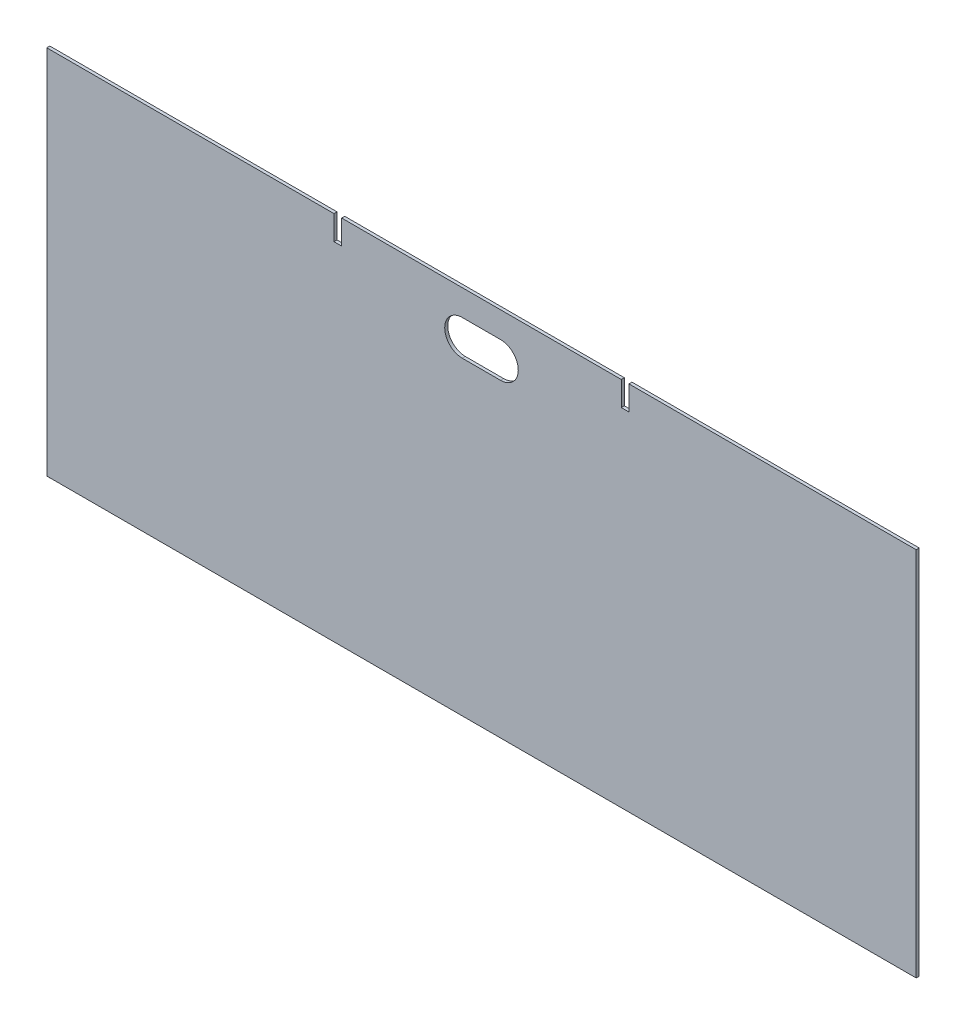
ISO-10303-21;
HEADER;
FILE_DESCRIPTION(('STEP AP214'),'2;1');
FILE_NAME('part.step','',(''),(''),'','','');
FILE_SCHEMA(('AUTOMOTIVE_DESIGN { 1 0 10303 214 1 1 1 1 }'));
ENDSEC;
DATA;
#1=APPLICATION_CONTEXT('core data for automotive mechanical design processes');
#2=APPLICATION_PROTOCOL_DEFINITION('international standard','automotive_design',2000,#1);
#3=PRODUCT_CONTEXT('',#1,'mechanical');
#4=PRODUCT('Part','Part','',(#3));
#5=PRODUCT_RELATED_PRODUCT_CATEGORY('part','',(#4));
#6=PRODUCT_DEFINITION_FORMATION('','',#4);
#7=PRODUCT_DEFINITION_CONTEXT('part definition',#1,'design');
#8=PRODUCT_DEFINITION('design','',#6,#7);
#9=PRODUCT_DEFINITION_SHAPE('','',#8);
#10=(LENGTH_UNIT() NAMED_UNIT(*) SI_UNIT(.MILLI.,.METRE.));
#11=(NAMED_UNIT(*) PLANE_ANGLE_UNIT() SI_UNIT($,.RADIAN.));
#12=(NAMED_UNIT(*) SI_UNIT($,.STERADIAN.) SOLID_ANGLE_UNIT());
#13=UNCERTAINTY_MEASURE_WITH_UNIT(LENGTH_MEASURE(1.E-05),#10,'distance_accuracy_value','');
#14=(GEOMETRIC_REPRESENTATION_CONTEXT(3) GLOBAL_UNCERTAINTY_ASSIGNED_CONTEXT((#13)) GLOBAL_UNIT_ASSIGNED_CONTEXT((#10,
#11,#12)) REPRESENTATION_CONTEXT('',''));
#15=CARTESIAN_POINT('',(0.,0.,0.));
#16=DIRECTION('',(0.,0.,1.));
#17=DIRECTION('',(1.,0.,0.));
#18=AXIS2_PLACEMENT_3D('',#15,#16,#17);
#19=CARTESIAN_POINT('',(-908.05,774.7,6.35));
#20=DIRECTION('',(0.,-1.,0.));
#21=DIRECTION('',(0.,0.,-1.));
#22=AXIS2_PLACEMENT_3D('',#19,#20,#21);
#23=PLANE('',#22);
#24=DIRECTION('',(-1.,0.,0.));
#25=VECTOR('',#24,1.);
#26=CARTESIAN_POINT('',(-908.05,774.7,6.35));
#27=LINE('',#26,#25);
#28=CARTESIAN_POINT('',(-307.975,774.7,6.35));
#29=VERTEX_POINT('',#28);
#30=CARTESIAN_POINT('',(-908.05,774.7,6.35));
#31=VERTEX_POINT('',#30);
#32=EDGE_CURVE('E178',#29,#31,#27,.T.);
#33=ORIENTED_EDGE('',*,*,#32,.F.);
#34=DIRECTION('',(0.,0.,1.));
#35=VECTOR('',#34,1.);
#36=CARTESIAN_POINT('',(-307.975,774.7,0.));
#37=LINE('',#36,#35);
#38=CARTESIAN_POINT('',(-307.975,774.7,0.));
#39=VERTEX_POINT('',#38);
#40=EDGE_CURVE('E188',#39,#29,#37,.T.);
#41=ORIENTED_EDGE('',*,*,#40,.F.);
#42=DIRECTION('',(-1.,0.,0.));
#43=VECTOR('',#42,1.);
#44=CARTESIAN_POINT('',(-908.05,774.7,0.));
#45=LINE('',#44,#43);
#46=CARTESIAN_POINT('',(-908.05,774.7,0.));
#47=VERTEX_POINT('',#46);
#48=EDGE_CURVE('E192',#39,#47,#45,.T.);
#49=ORIENTED_EDGE('',*,*,#48,.T.);
#50=DIRECTION('',(0.,0.,-1.));
#51=VECTOR('',#50,1.);
#52=CARTESIAN_POINT('',(-908.05,774.7,6.35));
#53=LINE('',#52,#51);
#54=EDGE_CURVE('E182',#31,#47,#53,.T.);
#55=ORIENTED_EDGE('',*,*,#54,.F.);
#56=EDGE_LOOP('',(#33,#41,#49,#55));
#57=FACE_BOUND('',#56,.T.);
#58=ADVANCED_FACE('F45',(#57),#23,.F.);
#59=CARTESIAN_POINT('',(292.1,774.7,0.));
#60=VERTEX_POINT('',#59);
#61=CARTESIAN_POINT('',(-292.1,774.7,0.));
#62=VERTEX_POINT('',#61);
#63=EDGE_CURVE('E194',#60,#62,#45,.T.);
#64=ORIENTED_EDGE('',*,*,#63,.T.);
#65=DIRECTION('',(0.,0.,1.));
#66=VECTOR('',#65,1.);
#67=CARTESIAN_POINT('',(-292.1,774.7,0.));
#68=LINE('',#67,#66);
#69=CARTESIAN_POINT('',(-292.1,774.7,6.35));
#70=VERTEX_POINT('',#69);
#71=EDGE_CURVE('E238',#62,#70,#68,.T.);
#72=ORIENTED_EDGE('',*,*,#71,.T.);
#73=CARTESIAN_POINT('',(292.1,774.7,6.35));
#74=VERTEX_POINT('',#73);
#75=EDGE_CURVE('E183',#74,#70,#27,.T.);
#76=ORIENTED_EDGE('',*,*,#75,.F.);
#77=DIRECTION('',(0.,0.,1.));
#78=VECTOR('',#77,1.);
#79=CARTESIAN_POINT('',(292.1,774.7,0.));
#80=LINE('',#79,#78);
#81=EDGE_CURVE('E206',#60,#74,#80,.T.);
#82=ORIENTED_EDGE('',*,*,#81,.F.);
#83=EDGE_LOOP('',(#64,#72,#76,#82));
#84=FACE_BOUND('',#83,.T.);
#85=ADVANCED_FACE('F262',(#84),#23,.F.);
#86=CARTESIAN_POINT('',(-908.05,0.,6.35));
#87=DIRECTION('',(1.,0.,0.));
#88=DIRECTION('',(0.,0.,-1.));
#89=AXIS2_PLACEMENT_3D('',#86,#87,#88);
#90=PLANE('',#89);
#91=DIRECTION('',(0.,-1.,0.));
#92=VECTOR('',#91,1.);
#93=CARTESIAN_POINT('',(-908.05,0.,0.));
#94=LINE('',#93,#92);
#95=CARTESIAN_POINT('',(-908.05,0.,0.));
#96=VERTEX_POINT('',#95);
#97=EDGE_CURVE('E184',#47,#96,#94,.T.);
#98=ORIENTED_EDGE('',*,*,#97,.T.);
#99=DIRECTION('',(0.,0.,-1.));
#100=VECTOR('',#99,1.);
#101=CARTESIAN_POINT('',(-908.05,0.,6.35));
#102=LINE('',#101,#100);
#103=CARTESIAN_POINT('',(-908.05,0.,6.35));
#104=VERTEX_POINT('',#103);
#105=EDGE_CURVE('E11',#104,#96,#102,.T.);
#106=ORIENTED_EDGE('',*,*,#105,.F.);
#107=DIRECTION('',(0.,-1.,0.));
#108=VECTOR('',#107,1.);
#109=CARTESIAN_POINT('',(-908.05,0.,6.35));
#110=LINE('',#109,#108);
#111=EDGE_CURVE('E170',#31,#104,#110,.T.);
#112=ORIENTED_EDGE('',*,*,#111,.F.);
#113=ORIENTED_EDGE('',*,*,#54,.T.);
#114=EDGE_LOOP('',(#98,#106,#112,#113));
#115=FACE_BOUND('',#114,.T.);
#116=ADVANCED_FACE('F47',(#115),#90,.F.);
#117=CARTESIAN_POINT('',(-908.05,0.,6.35));
#118=DIRECTION('',(0.,1.,0.));
#119=DIRECTION('',(0.,0.,1.));
#120=AXIS2_PLACEMENT_3D('',#117,#118,#119);
#121=PLANE('',#120);
#122=DIRECTION('',(1.,0.,0.));
#123=VECTOR('',#122,1.);
#124=CARTESIAN_POINT('',(-908.05,0.,0.));
#125=LINE('',#124,#123);
#126=CARTESIAN_POINT('',(908.05,0.,0.));
#127=VERTEX_POINT('',#126);
#128=EDGE_CURVE('E187',#96,#127,#125,.T.);
#129=ORIENTED_EDGE('',*,*,#128,.T.);
#130=DIRECTION('',(0.,0.,-1.));
#131=VECTOR('',#130,1.);
#132=CARTESIAN_POINT('',(908.05,0.,6.35));
#133=LINE('',#132,#131);
#134=CARTESIAN_POINT('',(908.05,0.,6.35));
#135=VERTEX_POINT('',#134);
#136=EDGE_CURVE('E54',#135,#127,#133,.T.);
#137=ORIENTED_EDGE('',*,*,#136,.F.);
#138=DIRECTION('',(1.,0.,0.));
#139=VECTOR('',#138,1.);
#140=CARTESIAN_POINT('',(-908.05,0.,6.35));
#141=LINE('',#140,#139);
#142=EDGE_CURVE('E173',#104,#135,#141,.T.);
#143=ORIENTED_EDGE('',*,*,#142,.F.);
#144=ORIENTED_EDGE('',*,*,#105,.T.);
#145=EDGE_LOOP('',(#129,#137,#143,#144));
#146=FACE_BOUND('',#145,.T.);
#147=ADVANCED_FACE('F282',(#146),#121,.F.);
#148=CARTESIAN_POINT('',(908.05,0.,6.35));
#149=DIRECTION('',(-1.,0.,0.));
#150=DIRECTION('',(0.,0.,1.));
#151=AXIS2_PLACEMENT_3D('',#148,#149,#150);
#152=PLANE('',#151);
#153=DIRECTION('',(0.,1.,0.));
#154=VECTOR('',#153,1.);
#155=CARTESIAN_POINT('',(908.05,0.,0.));
#156=LINE('',#155,#154);
#157=CARTESIAN_POINT('',(908.05,774.7,0.));
#158=VERTEX_POINT('',#157);
#159=EDGE_CURVE('E190',#127,#158,#156,.T.);
#160=ORIENTED_EDGE('',*,*,#159,.T.);
#161=DIRECTION('',(0.,0.,-1.));
#162=VECTOR('',#161,1.);
#163=CARTESIAN_POINT('',(908.05,774.7,6.35));
#164=LINE('',#163,#162);
#165=CARTESIAN_POINT('',(908.05,774.7,6.35));
#166=VERTEX_POINT('',#165);
#167=EDGE_CURVE('E197',#166,#158,#164,.T.);
#168=ORIENTED_EDGE('',*,*,#167,.F.);
#169=DIRECTION('',(0.,1.,0.));
#170=VECTOR('',#169,1.);
#171=CARTESIAN_POINT('',(908.05,0.,6.35));
#172=LINE('',#171,#170);
#173=EDGE_CURVE('E176',#135,#166,#172,.T.);
#174=ORIENTED_EDGE('',*,*,#173,.F.);
#175=ORIENTED_EDGE('',*,*,#136,.T.);
#176=EDGE_LOOP('',(#160,#168,#174,#175));
#177=FACE_BOUND('',#176,.T.);
#178=ADVANCED_FACE('F273',(#177),#152,.F.);
#179=CARTESIAN_POINT('',(307.975,774.7,0.));
#180=VERTEX_POINT('',#179);
#181=EDGE_CURVE('E174',#158,#180,#45,.T.);
#182=ORIENTED_EDGE('',*,*,#181,.T.);
#183=DIRECTION('',(0.,0.,1.));
#184=VECTOR('',#183,1.);
#185=CARTESIAN_POINT('',(307.975,774.7,0.));
#186=LINE('',#185,#184);
#187=CARTESIAN_POINT('',(307.975,774.7,6.35));
#188=VERTEX_POINT('',#187);
#189=EDGE_CURVE('E146',#180,#188,#186,.T.);
#190=ORIENTED_EDGE('',*,*,#189,.T.);
#191=EDGE_CURVE('E179',#166,#188,#27,.T.);
#192=ORIENTED_EDGE('',*,*,#191,.F.);
#193=ORIENTED_EDGE('',*,*,#167,.T.);
#194=EDGE_LOOP('',(#182,#190,#192,#193));
#195=FACE_BOUND('',#194,.T.);
#196=ADVANCED_FACE('F265',(#195),#23,.F.);
#197=CARTESIAN_POINT('',(0.,0.,6.35));
#198=DIRECTION('',(0.,0.,-1.));
#199=DIRECTION('',(-1.,0.,0.));
#200=AXIS2_PLACEMENT_3D('',#197,#198,#199);
#201=PLANE('',#200);
#202=DIRECTION('',(1.,0.,0.));
#203=VECTOR('',#202,1.);
#204=CARTESIAN_POINT('',(-40.,647.075,6.35));
#205=LINE('',#204,#203);
#206=CARTESIAN_POINT('',(-40.,647.075,6.35));
#207=VERTEX_POINT('',#206);
#208=CARTESIAN_POINT('',(40.,647.075,6.35));
#209=VERTEX_POINT('',#208);
#210=EDGE_CURVE('E202',#207,#209,#205,.T.);
#211=ORIENTED_EDGE('',*,*,#210,.F.);
#212=CARTESIAN_POINT('',(-40.,683.9,6.35));
#213=DIRECTION('',(0.,0.,1.));
#214=DIRECTION('',(1.,0.,0.));
#215=AXIS2_PLACEMENT_3D('',#212,#213,#214);
#216=CIRCLE('',#215,36.8249999999999);
#217=CARTESIAN_POINT('',(-40.,720.725,6.35));
#218=VERTEX_POINT('',#217);
#219=EDGE_CURVE('E49',#218,#207,#216,.T.);
#220=ORIENTED_EDGE('',*,*,#219,.F.);
#221=DIRECTION('',(-1.,0.,0.));
#222=VECTOR('',#221,1.);
#223=CARTESIAN_POINT('',(-40.,720.725,6.35));
#224=LINE('',#223,#222);
#225=CARTESIAN_POINT('',(40.,720.725,6.35));
#226=VERTEX_POINT('',#225);
#227=EDGE_CURVE('E90',#226,#218,#224,.T.);
#228=ORIENTED_EDGE('',*,*,#227,.F.);
#229=CARTESIAN_POINT('',(40.,683.9,6.35));
#230=DIRECTION('',(0.,0.,1.));
#231=DIRECTION('',(1.,0.,0.));
#232=AXIS2_PLACEMENT_3D('',#229,#230,#231);
#233=CIRCLE('',#232,36.825);
#234=EDGE_CURVE('E204',#209,#226,#233,.T.);
#235=ORIENTED_EDGE('',*,*,#234,.F.);
#236=EDGE_LOOP('',(#211,#220,#228,#235));
#237=FACE_BOUND('',#236,.T.);
#238=DIRECTION('',(1.,0.,0.));
#239=VECTOR('',#238,1.);
#240=CARTESIAN_POINT('',(-307.975,723.9,6.35));
#241=LINE('',#240,#239);
#242=CARTESIAN_POINT('',(-307.975,723.9,6.35));
#243=VERTEX_POINT('',#242);
#244=CARTESIAN_POINT('',(-292.1,723.9,6.35));
#245=VERTEX_POINT('',#244);
#246=EDGE_CURVE('E219',#243,#245,#241,.T.);
#247=ORIENTED_EDGE('',*,*,#246,.F.);
#248=DIRECTION('',(0.,-1.,0.));
#249=VECTOR('',#248,1.);
#250=CARTESIAN_POINT('',(-307.975,774.7,6.35));
#251=LINE('',#250,#249);
#252=EDGE_CURVE('E217',#29,#243,#251,.T.);
#253=ORIENTED_EDGE('',*,*,#252,.F.);
#254=ORIENTED_EDGE('',*,*,#32,.T.);
#255=ORIENTED_EDGE('',*,*,#111,.T.);
#256=ORIENTED_EDGE('',*,*,#142,.T.);
#257=ORIENTED_EDGE('',*,*,#173,.T.);
#258=ORIENTED_EDGE('',*,*,#191,.T.);
#259=DIRECTION('',(0.,1.,0.));
#260=VECTOR('',#259,1.);
#261=CARTESIAN_POINT('',(307.975,774.7,6.35));
#262=LINE('',#261,#260);
#263=CARTESIAN_POINT('',(307.975,723.9,6.35));
#264=VERTEX_POINT('',#263);
#265=EDGE_CURVE('E166',#264,#188,#262,.T.);
#266=ORIENTED_EDGE('',*,*,#265,.F.);
#267=DIRECTION('',(1.,0.,0.));
#268=VECTOR('',#267,1.);
#269=CARTESIAN_POINT('',(292.1,723.9,6.35));
#270=LINE('',#269,#268);
#271=CARTESIAN_POINT('',(292.1,723.9,6.35));
#272=VERTEX_POINT('',#271);
#273=EDGE_CURVE('E159',#272,#264,#270,.T.);
#274=ORIENTED_EDGE('',*,*,#273,.F.);
#275=DIRECTION('',(0.,-1.,0.));
#276=VECTOR('',#275,1.);
#277=CARTESIAN_POINT('',(292.1,774.7,6.35));
#278=LINE('',#277,#276);
#279=EDGE_CURVE('E216',#74,#272,#278,.T.);
#280=ORIENTED_EDGE('',*,*,#279,.F.);
#281=ORIENTED_EDGE('',*,*,#75,.T.);
#282=DIRECTION('',(0.,1.,0.));
#283=VECTOR('',#282,1.);
#284=CARTESIAN_POINT('',(-292.1,774.7,6.35));
#285=LINE('',#284,#283);
#286=EDGE_CURVE('E228',#245,#70,#285,.T.);
#287=ORIENTED_EDGE('',*,*,#286,.F.);
#288=EDGE_LOOP('',(#247,#253,#254,#255,#256,#257,#258,#266,#274,#280,#281,#287));
#289=FACE_BOUND('',#288,.T.);
#290=ADVANCED_FACE('F256',(#237,#289),#201,.F.);
#291=CARTESIAN_POINT('',(0.,0.,0.));
#292=DIRECTION('',(0.,0.,-1.));
#293=DIRECTION('',(-1.,0.,0.));
#294=AXIS2_PLACEMENT_3D('',#291,#292,#293);
#295=PLANE('',#294);
#296=CARTESIAN_POINT('',(-40.,683.9,0.));
#297=DIRECTION('',(0.,0.,1.));
#298=DIRECTION('',(1.,0.,0.));
#299=AXIS2_PLACEMENT_3D('',#296,#297,#298);
#300=CIRCLE('',#299,36.8249999999999);
#301=CARTESIAN_POINT('',(-40.,720.725,0.));
#302=VERTEX_POINT('',#301);
#303=CARTESIAN_POINT('',(-40.,647.075,0.));
#304=VERTEX_POINT('',#303);
#305=EDGE_CURVE('E329',#302,#304,#300,.T.);
#306=ORIENTED_EDGE('',*,*,#305,.T.);
#307=DIRECTION('',(1.,0.,0.));
#308=VECTOR('',#307,1.);
#309=CARTESIAN_POINT('',(-40.,647.075,0.));
#310=LINE('',#309,#308);
#311=CARTESIAN_POINT('',(40.,647.075,0.));
#312=VERTEX_POINT('',#311);
#313=EDGE_CURVE('E326',#304,#312,#310,.T.);
#314=ORIENTED_EDGE('',*,*,#313,.T.);
#315=CARTESIAN_POINT('',(40.,683.9,0.));
#316=DIRECTION('',(0.,0.,1.));
#317=DIRECTION('',(1.,0.,0.));
#318=AXIS2_PLACEMENT_3D('',#315,#316,#317);
#319=CIRCLE('',#318,36.825);
#320=CARTESIAN_POINT('',(40.,720.725,0.));
#321=VERTEX_POINT('',#320);
#322=EDGE_CURVE('E71',#312,#321,#319,.T.);
#323=ORIENTED_EDGE('',*,*,#322,.T.);
#324=DIRECTION('',(-1.,0.,0.));
#325=VECTOR('',#324,1.);
#326=CARTESIAN_POINT('',(-40.,720.725,0.));
#327=LINE('',#326,#325);
#328=EDGE_CURVE('E320',#321,#302,#327,.T.);
#329=ORIENTED_EDGE('',*,*,#328,.T.);
#330=EDGE_LOOP('',(#306,#314,#323,#329));
#331=FACE_BOUND('',#330,.T.);
#332=DIRECTION('',(0.,-1.,0.));
#333=VECTOR('',#332,1.);
#334=CARTESIAN_POINT('',(-307.975,774.7,0.));
#335=LINE('',#334,#333);
#336=CARTESIAN_POINT('',(-307.975,723.9,0.));
#337=VERTEX_POINT('',#336);
#338=EDGE_CURVE('E236',#39,#337,#335,.T.);
#339=ORIENTED_EDGE('',*,*,#338,.T.);
#340=DIRECTION('',(1.,0.,0.));
#341=VECTOR('',#340,1.);
#342=CARTESIAN_POINT('',(-307.975,723.9,0.));
#343=LINE('',#342,#341);
#344=CARTESIAN_POINT('',(-292.1,723.9,0.));
#345=VERTEX_POINT('',#344);
#346=EDGE_CURVE('E311',#337,#345,#343,.T.);
#347=ORIENTED_EDGE('',*,*,#346,.T.);
#348=DIRECTION('',(0.,1.,0.));
#349=VECTOR('',#348,1.);
#350=CARTESIAN_POINT('',(-292.1,774.7,0.));
#351=LINE('',#350,#349);
#352=EDGE_CURVE('E231',#345,#62,#351,.T.);
#353=ORIENTED_EDGE('',*,*,#352,.T.);
#354=ORIENTED_EDGE('',*,*,#63,.F.);
#355=DIRECTION('',(0.,-1.,0.));
#356=VECTOR('',#355,1.);
#357=CARTESIAN_POINT('',(292.1,774.7,0.));
#358=LINE('',#357,#356);
#359=CARTESIAN_POINT('',(292.1,723.9,0.));
#360=VERTEX_POINT('',#359);
#361=EDGE_CURVE('E99',#60,#360,#358,.T.);
#362=ORIENTED_EDGE('',*,*,#361,.T.);
#363=DIRECTION('',(1.,0.,0.));
#364=VECTOR('',#363,1.);
#365=CARTESIAN_POINT('',(292.1,723.9,0.));
#366=LINE('',#365,#364);
#367=CARTESIAN_POINT('',(307.975,723.9,0.));
#368=VERTEX_POINT('',#367);
#369=EDGE_CURVE('E151',#360,#368,#366,.T.);
#370=ORIENTED_EDGE('',*,*,#369,.T.);
#371=DIRECTION('',(0.,1.,0.));
#372=VECTOR('',#371,1.);
#373=CARTESIAN_POINT('',(307.975,774.7,0.));
#374=LINE('',#373,#372);
#375=EDGE_CURVE('E138',#368,#180,#374,.T.);
#376=ORIENTED_EDGE('',*,*,#375,.T.);
#377=ORIENTED_EDGE('',*,*,#181,.F.);
#378=ORIENTED_EDGE('',*,*,#159,.F.);
#379=ORIENTED_EDGE('',*,*,#128,.F.);
#380=ORIENTED_EDGE('',*,*,#97,.F.);
#381=ORIENTED_EDGE('',*,*,#48,.F.);
#382=EDGE_LOOP('',(#339,#347,#353,#354,#362,#370,#376,#377,#378,#379,#380,#381));
#383=FACE_BOUND('',#382,.T.);
#384=ADVANCED_FACE('F163',(#331,#383),#295,.T.);
#385=CARTESIAN_POINT('',(292.1,774.7,0.));
#386=DIRECTION('',(-1.,0.,0.));
#387=DIRECTION('',(0.,0.,1.));
#388=AXIS2_PLACEMENT_3D('',#385,#386,#387);
#389=PLANE('',#388);
#390=ORIENTED_EDGE('',*,*,#279,.T.);
#391=DIRECTION('',(0.,0.,1.));
#392=VECTOR('',#391,1.);
#393=CARTESIAN_POINT('',(292.1,723.9,0.));
#394=LINE('',#393,#392);
#395=EDGE_CURVE('E152',#360,#272,#394,.T.);
#396=ORIENTED_EDGE('',*,*,#395,.F.);
#397=ORIENTED_EDGE('',*,*,#361,.F.);
#398=ORIENTED_EDGE('',*,*,#81,.T.);
#399=EDGE_LOOP('',(#390,#396,#397,#398));
#400=FACE_BOUND('',#399,.T.);
#401=ADVANCED_FACE('F247',(#400),#389,.F.);
#402=CARTESIAN_POINT('',(307.975,774.7,0.));
#403=DIRECTION('',(1.,0.,0.));
#404=DIRECTION('',(0.,0.,-1.));
#405=AXIS2_PLACEMENT_3D('',#402,#403,#404);
#406=PLANE('',#405);
#407=ORIENTED_EDGE('',*,*,#265,.T.);
#408=ORIENTED_EDGE('',*,*,#189,.F.);
#409=ORIENTED_EDGE('',*,*,#375,.F.);
#410=DIRECTION('',(0.,0.,1.));
#411=VECTOR('',#410,1.);
#412=CARTESIAN_POINT('',(307.975,723.9,0.));
#413=LINE('',#412,#411);
#414=EDGE_CURVE('E143',#368,#264,#413,.T.);
#415=ORIENTED_EDGE('',*,*,#414,.T.);
#416=EDGE_LOOP('',(#407,#408,#409,#415));
#417=FACE_BOUND('',#416,.T.);
#418=ADVANCED_FACE('F141',(#417),#406,.F.);
#419=CARTESIAN_POINT('',(292.1,723.9,0.));
#420=DIRECTION('',(0.,-1.,0.));
#421=DIRECTION('',(0.,0.,-1.));
#422=AXIS2_PLACEMENT_3D('',#419,#420,#421);
#423=PLANE('',#422);
#424=ORIENTED_EDGE('',*,*,#273,.T.);
#425=ORIENTED_EDGE('',*,*,#414,.F.);
#426=ORIENTED_EDGE('',*,*,#369,.F.);
#427=ORIENTED_EDGE('',*,*,#395,.T.);
#428=EDGE_LOOP('',(#424,#425,#426,#427));
#429=FACE_BOUND('',#428,.T.);
#430=ADVANCED_FACE('F156',(#429),#423,.F.);
#431=CARTESIAN_POINT('',(-307.975,774.7,0.));
#432=DIRECTION('',(-1.,0.,0.));
#433=DIRECTION('',(0.,0.,1.));
#434=AXIS2_PLACEMENT_3D('',#431,#432,#433);
#435=PLANE('',#434);
#436=ORIENTED_EDGE('',*,*,#252,.T.);
#437=DIRECTION('',(0.,0.,1.));
#438=VECTOR('',#437,1.);
#439=CARTESIAN_POINT('',(-307.975,723.9,0.));
#440=LINE('',#439,#438);
#441=EDGE_CURVE('E244',#337,#243,#440,.T.);
#442=ORIENTED_EDGE('',*,*,#441,.F.);
#443=ORIENTED_EDGE('',*,*,#338,.F.);
#444=ORIENTED_EDGE('',*,*,#40,.T.);
#445=EDGE_LOOP('',(#436,#442,#443,#444));
#446=FACE_BOUND('',#445,.T.);
#447=ADVANCED_FACE('F353',(#446),#435,.F.);
#448=CARTESIAN_POINT('',(-292.1,774.7,0.));
#449=DIRECTION('',(1.,0.,0.));
#450=DIRECTION('',(0.,0.,-1.));
#451=AXIS2_PLACEMENT_3D('',#448,#449,#450);
#452=PLANE('',#451);
#453=ORIENTED_EDGE('',*,*,#286,.T.);
#454=ORIENTED_EDGE('',*,*,#71,.F.);
#455=ORIENTED_EDGE('',*,*,#352,.F.);
#456=DIRECTION('',(0.,0.,1.));
#457=VECTOR('',#456,1.);
#458=CARTESIAN_POINT('',(-292.1,723.9,0.));
#459=LINE('',#458,#457);
#460=EDGE_CURVE('E241',#345,#245,#459,.T.);
#461=ORIENTED_EDGE('',*,*,#460,.T.);
#462=EDGE_LOOP('',(#453,#454,#455,#461));
#463=FACE_BOUND('',#462,.T.);
#464=ADVANCED_FACE('F350',(#463),#452,.F.);
#465=CARTESIAN_POINT('',(-307.975,723.9,0.));
#466=DIRECTION('',(0.,-1.,0.));
#467=DIRECTION('',(0.,0.,-1.));
#468=AXIS2_PLACEMENT_3D('',#465,#466,#467);
#469=PLANE('',#468);
#470=ORIENTED_EDGE('',*,*,#246,.T.);
#471=ORIENTED_EDGE('',*,*,#460,.F.);
#472=ORIENTED_EDGE('',*,*,#346,.F.);
#473=ORIENTED_EDGE('',*,*,#441,.T.);
#474=EDGE_LOOP('',(#470,#471,#472,#473));
#475=FACE_BOUND('',#474,.T.);
#476=ADVANCED_FACE('F352',(#475),#469,.F.);
#477=CARTESIAN_POINT('',(-40.,683.9,0.));
#478=DIRECTION('',(0.,0.,1.));
#479=DIRECTION('',(1.,0.,0.));
#480=AXIS2_PLACEMENT_3D('',#477,#478,#479);
#481=CYLINDRICAL_SURFACE('',#480,36.8249999999999);
#482=DIRECTION('',(0.,0.,1.));
#483=VECTOR('',#482,1.);
#484=CARTESIAN_POINT('',(-40.,647.075,0.));
#485=LINE('',#484,#483);
#486=EDGE_CURVE('E62',#304,#207,#485,.T.);
#487=ORIENTED_EDGE('',*,*,#486,.F.);
#488=ORIENTED_EDGE('',*,*,#305,.F.);
#489=DIRECTION('',(0.,0.,1.));
#490=VECTOR('',#489,1.);
#491=CARTESIAN_POINT('',(-40.,720.725,0.));
#492=LINE('',#491,#490);
#493=EDGE_CURVE('E205',#302,#218,#492,.T.);
#494=ORIENTED_EDGE('',*,*,#493,.T.);
#495=ORIENTED_EDGE('',*,*,#219,.T.);
#496=EDGE_LOOP('',(#487,#488,#494,#495));
#497=FACE_BOUND('',#496,.T.);
#498=ADVANCED_FACE('F336',(#497),#481,.F.);
#499=CARTESIAN_POINT('',(-40.,720.725,0.));
#500=DIRECTION('',(0.,1.,0.));
#501=DIRECTION('',(-1.,0.,0.));
#502=AXIS2_PLACEMENT_3D('',#499,#500,#501);
#503=PLANE('',#502);
#504=ORIENTED_EDGE('',*,*,#493,.F.);
#505=ORIENTED_EDGE('',*,*,#328,.F.);
#506=DIRECTION('',(0.,0.,1.));
#507=VECTOR('',#506,1.);
#508=CARTESIAN_POINT('',(40.,720.725,0.));
#509=LINE('',#508,#507);
#510=EDGE_CURVE('E318',#321,#226,#509,.T.);
#511=ORIENTED_EDGE('',*,*,#510,.T.);
#512=ORIENTED_EDGE('',*,*,#227,.T.);
#513=EDGE_LOOP('',(#504,#505,#511,#512));
#514=FACE_BOUND('',#513,.T.);
#515=ADVANCED_FACE('F365',(#514),#503,.F.);
#516=CARTESIAN_POINT('',(40.,683.9,0.));
#517=DIRECTION('',(0.,0.,1.));
#518=DIRECTION('',(1.,0.,0.));
#519=AXIS2_PLACEMENT_3D('',#516,#517,#518);
#520=CYLINDRICAL_SURFACE('',#519,36.825);
#521=ORIENTED_EDGE('',*,*,#510,.F.);
#522=ORIENTED_EDGE('',*,*,#322,.F.);
#523=DIRECTION('',(0.,0.,1.));
#524=VECTOR('',#523,1.);
#525=CARTESIAN_POINT('',(40.,647.075,0.));
#526=LINE('',#525,#524);
#527=EDGE_CURVE('E316',#312,#209,#526,.T.);
#528=ORIENTED_EDGE('',*,*,#527,.T.);
#529=ORIENTED_EDGE('',*,*,#234,.T.);
#530=EDGE_LOOP('',(#521,#522,#528,#529));
#531=FACE_BOUND('',#530,.T.);
#532=ADVANCED_FACE('F369',(#531),#520,.F.);
#533=CARTESIAN_POINT('',(-40.,647.075,0.));
#534=DIRECTION('',(0.,-1.,0.));
#535=DIRECTION('',(1.,0.,0.));
#536=AXIS2_PLACEMENT_3D('',#533,#534,#535);
#537=PLANE('',#536);
#538=ORIENTED_EDGE('',*,*,#527,.F.);
#539=ORIENTED_EDGE('',*,*,#313,.F.);
#540=ORIENTED_EDGE('',*,*,#486,.T.);
#541=ORIENTED_EDGE('',*,*,#210,.T.);
#542=EDGE_LOOP('',(#538,#539,#540,#541));
#543=FACE_BOUND('',#542,.T.);
#544=ADVANCED_FACE('F366',(#543),#537,.F.);
#545=CLOSED_SHELL('',(#58,#85,#116,#147,#178,#196,#290,#384,#401,#418,#430,#447,#464,#476,#498,
#515,#532,#544));
#546=MANIFOLD_SOLID_BREP('B2',#545);
#547=ADVANCED_BREP_SHAPE_REPRESENTATION('',(#18,#546),#14);
#548=SHAPE_DEFINITION_REPRESENTATION(#9,#547);
ENDSEC;
END-ISO-10303-21;
